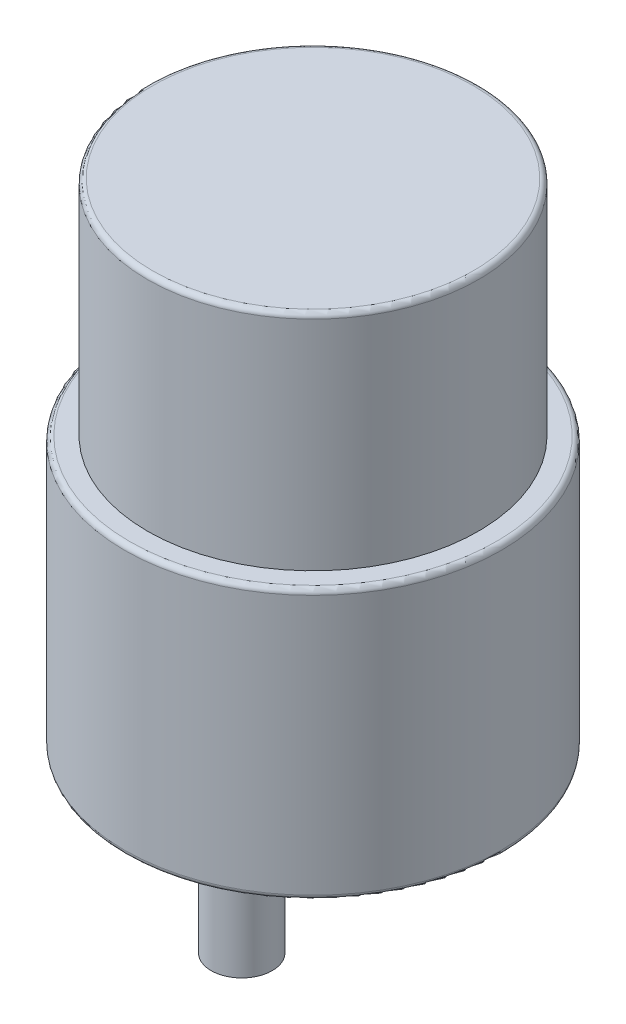
ISO-10303-21;
HEADER;
FILE_DESCRIPTION(('STEP AP214'),'2;1');
FILE_NAME('part.step','',(''),(''),'','','');
FILE_SCHEMA(('AUTOMOTIVE_DESIGN { 1 0 10303 214 1 1 1 1 }'));
ENDSEC;
DATA;
#1=APPLICATION_CONTEXT('core data for automotive mechanical design processes');
#2=APPLICATION_PROTOCOL_DEFINITION('international standard','automotive_design',2000,#1);
#3=PRODUCT_CONTEXT('',#1,'mechanical');
#4=PRODUCT('Part','Part','',(#3));
#5=PRODUCT_RELATED_PRODUCT_CATEGORY('part','',(#4));
#6=PRODUCT_DEFINITION_FORMATION('','',#4);
#7=PRODUCT_DEFINITION_CONTEXT('part definition',#1,'design');
#8=PRODUCT_DEFINITION('design','',#6,#7);
#9=PRODUCT_DEFINITION_SHAPE('','',#8);
#10=(LENGTH_UNIT() NAMED_UNIT(*) SI_UNIT(.MILLI.,.METRE.));
#11=(NAMED_UNIT(*) PLANE_ANGLE_UNIT() SI_UNIT($,.RADIAN.));
#12=(NAMED_UNIT(*) SI_UNIT($,.STERADIAN.) SOLID_ANGLE_UNIT());
#13=UNCERTAINTY_MEASURE_WITH_UNIT(LENGTH_MEASURE(1.E-05),#10,'distance_accuracy_value','');
#14=(GEOMETRIC_REPRESENTATION_CONTEXT(3) GLOBAL_UNCERTAINTY_ASSIGNED_CONTEXT((#13)) GLOBAL_UNIT_ASSIGNED_CONTEXT((#10,
#11,#12)) REPRESENTATION_CONTEXT('',''));
#15=CARTESIAN_POINT('',(0.,0.,0.));
#16=DIRECTION('',(0.,0.,1.));
#17=DIRECTION('',(1.,0.,0.));
#18=AXIS2_PLACEMENT_3D('',#15,#16,#17);
#19=CARTESIAN_POINT('',(0.,26.5,0.));
#20=DIRECTION('',(0.,-1.,0.));
#21=DIRECTION('',(0.,0.,-1.));
#22=AXIS2_PLACEMENT_3D('',#19,#20,#21);
#23=CYLINDRICAL_SURFACE('',#22,18.5);
#24=CARTESIAN_POINT('',(0.,26.,0.));
#25=DIRECTION('',(0.,1.,0.));
#26=DIRECTION('',(0.,0.,1.));
#27=AXIS2_PLACEMENT_3D('',#24,#25,#26);
#28=CIRCLE('',#27,18.5);
#29=CARTESIAN_POINT('',(0.,26.,18.5));
#30=VERTEX_POINT('',#29);
#31=EDGE_CURVE('E47',#30,#30,#28,.F.);
#32=ORIENTED_EDGE('',*,*,#31,.T.);
#33=EDGE_LOOP('',(#32));
#34=FACE_BOUND('',#33,.T.);
#35=CARTESIAN_POINT('',(0.,0.5,0.));
#36=DIRECTION('',(0.,1.,0.));
#37=DIRECTION('',(0.,0.,1.));
#38=AXIS2_PLACEMENT_3D('',#35,#36,#37);
#39=CIRCLE('',#38,18.5);
#40=CARTESIAN_POINT('',(0.,0.5,18.5));
#41=VERTEX_POINT('',#40);
#42=EDGE_CURVE('E114',#41,#41,#39,.T.);
#43=ORIENTED_EDGE('',*,*,#42,.T.);
#44=EDGE_LOOP('',(#43));
#45=FACE_BOUND('',#44,.T.);
#46=ADVANCED_FACE('F38',(#34,#45),#23,.T.);
#47=CARTESIAN_POINT('',(0.,26.5,0.));
#48=DIRECTION('',(0.,1.,0.));
#49=DIRECTION('',(0.,0.,1.));
#50=AXIS2_PLACEMENT_3D('',#47,#48,#49);
#51=PLANE('',#50);
#52=CARTESIAN_POINT('',(0.,26.5,0.));
#53=DIRECTION('',(0.,1.,0.));
#54=DIRECTION('',(0.,0.,1.));
#55=AXIS2_PLACEMENT_3D('',#52,#53,#54);
#56=CIRCLE('',#55,18.);
#57=CARTESIAN_POINT('',(0.,26.5,18.));
#58=VERTEX_POINT('',#57);
#59=EDGE_CURVE('E110',#58,#58,#56,.T.);
#60=ORIENTED_EDGE('',*,*,#59,.T.);
#61=EDGE_LOOP('',(#60));
#62=FACE_BOUND('',#61,.T.);
#63=CARTESIAN_POINT('',(0.,26.5,0.));
#64=DIRECTION('',(0.,1.,0.));
#65=DIRECTION('',(0.,0.,1.));
#66=AXIS2_PLACEMENT_3D('',#63,#64,#65);
#67=CIRCLE('',#66,16.25);
#68=CARTESIAN_POINT('',(0.,26.5,16.25));
#69=VERTEX_POINT('',#68);
#70=EDGE_CURVE('E87',#69,#69,#67,.T.);
#71=ORIENTED_EDGE('',*,*,#70,.F.);
#72=EDGE_LOOP('',(#71));
#73=FACE_BOUND('',#72,.T.);
#74=ADVANCED_FACE('F129',(#62,#73),#51,.T.);
#75=CARTESIAN_POINT('',(0.,0.,0.));
#76=DIRECTION('',(0.,1.,0.));
#77=DIRECTION('',(0.,0.,1.));
#78=AXIS2_PLACEMENT_3D('',#75,#76,#77);
#79=PLANE('',#78);
#80=CARTESIAN_POINT('',(0.,0.,-15.5));
#81=DIRECTION('',(0.,-1.,0.));
#82=DIRECTION('',(0.,0.,-1.));
#83=AXIS2_PLACEMENT_3D('',#80,#81,#82);
#84=CIRCLE('',#83,1.5);
#85=CARTESIAN_POINT('',(0.,0.,-17.));
#86=VERTEX_POINT('',#85);
#87=EDGE_CURVE('E379',#86,#86,#84,.T.);
#88=ORIENTED_EDGE('',*,*,#87,.F.);
#89=EDGE_LOOP('',(#88));
#90=FACE_BOUND('',#89,.T.);
#91=CARTESIAN_POINT('',(13.4233937586587,0.,-7.75000000000016));
#92=DIRECTION('',(0.,-1.,0.));
#93=DIRECTION('',(0.,0.,-1.));
#94=AXIS2_PLACEMENT_3D('',#91,#92,#93);
#95=CIRCLE('',#94,1.5);
#96=CARTESIAN_POINT('',(13.4233937586587,0.,-9.25000000000016));
#97=VERTEX_POINT('',#96);
#98=EDGE_CURVE('E391',#97,#97,#95,.T.);
#99=ORIENTED_EDGE('',*,*,#98,.F.);
#100=EDGE_LOOP('',(#99));
#101=FACE_BOUND('',#100,.T.);
#102=CARTESIAN_POINT('',(13.4233937586589,0.,7.74999999999987));
#103=DIRECTION('',(0.,-1.,0.));
#104=DIRECTION('',(0.,0.,-1.));
#105=AXIS2_PLACEMENT_3D('',#102,#103,#104);
#106=CIRCLE('',#105,1.5);
#107=CARTESIAN_POINT('',(13.4233937586589,0.,6.24999999999988));
#108=VERTEX_POINT('',#107);
#109=EDGE_CURVE('E390',#108,#108,#106,.T.);
#110=ORIENTED_EDGE('',*,*,#109,.F.);
#111=EDGE_LOOP('',(#110));
#112=FACE_BOUND('',#111,.T.);
#113=CARTESIAN_POINT('',(1.08235921504137E-13,0.,15.5));
#114=DIRECTION('',(0.,-1.,0.));
#115=DIRECTION('',(0.,0.,-1.));
#116=AXIS2_PLACEMENT_3D('',#113,#114,#115);
#117=CIRCLE('',#116,1.5);
#118=CARTESIAN_POINT('',(1.08235921504137E-13,0.,14.));
#119=VERTEX_POINT('',#118);
#120=EDGE_CURVE('E414',#119,#119,#117,.T.);
#121=ORIENTED_EDGE('',*,*,#120,.F.);
#122=EDGE_LOOP('',(#121));
#123=FACE_BOUND('',#122,.T.);
#124=CARTESIAN_POINT('',(-13.4233937586588,0.,7.75000000000006));
#125=DIRECTION('',(0.,-1.,0.));
#126=DIRECTION('',(0.,0.,-1.));
#127=AXIS2_PLACEMENT_3D('',#124,#125,#126);
#128=CIRCLE('',#127,1.5);
#129=CARTESIAN_POINT('',(-13.4233937586588,0.,6.25000000000006));
#130=VERTEX_POINT('',#129);
#131=EDGE_CURVE('E406',#130,#130,#128,.T.);
#132=ORIENTED_EDGE('',*,*,#131,.F.);
#133=EDGE_LOOP('',(#132));
#134=FACE_BOUND('',#133,.T.);
#135=CARTESIAN_POINT('',(-13.4233937586588,0.,-7.74999999999997));
#136=DIRECTION('',(0.,-1.,0.));
#137=DIRECTION('',(0.,0.,-1.));
#138=AXIS2_PLACEMENT_3D('',#135,#136,#137);
#139=CIRCLE('',#138,1.5);
#140=CARTESIAN_POINT('',(-13.4233937586588,0.,-9.24999999999997));
#141=VERTEX_POINT('',#140);
#142=EDGE_CURVE('E398',#141,#141,#139,.T.);
#143=ORIENTED_EDGE('',*,*,#142,.F.);
#144=EDGE_LOOP('',(#143));
#145=FACE_BOUND('',#144,.T.);
#146=CARTESIAN_POINT('',(0.,0.,0.));
#147=DIRECTION('',(0.,1.,0.));
#148=DIRECTION('',(0.,0.,1.));
#149=AXIS2_PLACEMENT_3D('',#146,#147,#148);
#150=CIRCLE('',#149,18.);
#151=CARTESIAN_POINT('',(0.,0.,18.));
#152=VERTEX_POINT('',#151);
#153=EDGE_CURVE('E11',#152,#152,#150,.F.);
#154=ORIENTED_EDGE('',*,*,#153,.T.);
#155=EDGE_LOOP('',(#154));
#156=FACE_BOUND('',#155,.T.);
#157=CARTESIAN_POINT('',(-7.,0.,0.));
#158=DIRECTION('',(0.,1.,0.));
#159=DIRECTION('',(0.,0.,1.));
#160=AXIS2_PLACEMENT_3D('',#157,#158,#159);
#161=CIRCLE('',#160,6.);
#162=CARTESIAN_POINT('',(-7.,0.,6.));
#163=VERTEX_POINT('',#162);
#164=EDGE_CURVE('E95',#163,#163,#161,.F.);
#165=ORIENTED_EDGE('',*,*,#164,.F.);
#166=EDGE_LOOP('',(#165));
#167=FACE_BOUND('',#166,.T.);
#168=ADVANCED_FACE('F132',(#90,#101,#112,#123,#134,#145,#156,#167),#79,.F.);
#169=CARTESIAN_POINT('',(0.,48.4,0.));
#170=DIRECTION('',(0.,-1.,0.));
#171=DIRECTION('',(0.,0.,-1.));
#172=AXIS2_PLACEMENT_3D('',#169,#170,#171);
#173=CYLINDRICAL_SURFACE('',#172,16.25);
#174=CARTESIAN_POINT('',(0.,47.9,0.));
#175=DIRECTION('',(0.,1.,0.));
#176=DIRECTION('',(0.,0.,1.));
#177=AXIS2_PLACEMENT_3D('',#174,#175,#176);
#178=CIRCLE('',#177,16.25);
#179=CARTESIAN_POINT('',(0.,47.9,16.25));
#180=VERTEX_POINT('',#179);
#181=EDGE_CURVE('E106',#180,#180,#178,.F.);
#182=ORIENTED_EDGE('',*,*,#181,.T.);
#183=EDGE_LOOP('',(#182));
#184=FACE_BOUND('',#183,.T.);
#185=ORIENTED_EDGE('',*,*,#70,.T.);
#186=EDGE_LOOP('',(#185));
#187=FACE_BOUND('',#186,.T.);
#188=ADVANCED_FACE('F136',(#184,#187),#173,.T.);
#189=CARTESIAN_POINT('',(0.,48.4,0.));
#190=DIRECTION('',(0.,1.,0.));
#191=DIRECTION('',(0.,0.,1.));
#192=AXIS2_PLACEMENT_3D('',#189,#190,#191);
#193=PLANE('',#192);
#194=CARTESIAN_POINT('',(0.,48.4,0.));
#195=DIRECTION('',(0.,1.,0.));
#196=DIRECTION('',(0.,0.,1.));
#197=AXIS2_PLACEMENT_3D('',#194,#195,#196);
#198=CIRCLE('',#197,15.75);
#199=CARTESIAN_POINT('',(0.,48.4,15.75));
#200=VERTEX_POINT('',#199);
#201=EDGE_CURVE('E94',#200,#200,#198,.T.);
#202=ORIENTED_EDGE('',*,*,#201,.T.);
#203=EDGE_LOOP('',(#202));
#204=FACE_BOUND('',#203,.T.);
#205=ADVANCED_FACE('F138',(#204),#193,.T.);
#206=CARTESIAN_POINT('',(-7.,-6.,0.));
#207=DIRECTION('',(0.,1.,0.));
#208=DIRECTION('',(0.,0.,1.));
#209=AXIS2_PLACEMENT_3D('',#206,#207,#208);
#210=CYLINDRICAL_SURFACE('',#209,6.);
#211=CARTESIAN_POINT('',(-7.,-6.,0.));
#212=DIRECTION('',(0.,-1.,0.));
#213=DIRECTION('',(0.,0.,-1.));
#214=AXIS2_PLACEMENT_3D('',#211,#212,#213);
#215=CIRCLE('',#214,6.);
#216=CARTESIAN_POINT('',(-7.,-6.,-6.));
#217=VERTEX_POINT('',#216);
#218=EDGE_CURVE('E83',#217,#217,#215,.T.);
#219=ORIENTED_EDGE('',*,*,#218,.F.);
#220=EDGE_LOOP('',(#219));
#221=FACE_BOUND('',#220,.T.);
#222=ORIENTED_EDGE('',*,*,#164,.T.);
#223=EDGE_LOOP('',(#222));
#224=FACE_BOUND('',#223,.T.);
#225=ADVANCED_FACE('F145',(#221,#224),#210,.T.);
#226=CARTESIAN_POINT('',(-7.,-6.,0.));
#227=DIRECTION('',(0.,-1.,0.));
#228=DIRECTION('',(0.,0.,-1.));
#229=AXIS2_PLACEMENT_3D('',#226,#227,#228);
#230=PLANE('',#229);
#231=CARTESIAN_POINT('',(-7.,-6.,0.));
#232=DIRECTION('',(0.,-1.,0.));
#233=DIRECTION('',(0.,0.,-1.));
#234=AXIS2_PLACEMENT_3D('',#231,#232,#233);
#235=CIRCLE('',#234,3.);
#236=CARTESIAN_POINT('',(-7.,-6.,-3.));
#237=VERTEX_POINT('',#236);
#238=EDGE_CURVE('E91',#237,#237,#235,.T.);
#239=ORIENTED_EDGE('',*,*,#238,.F.);
#240=EDGE_LOOP('',(#239));
#241=FACE_BOUND('',#240,.T.);
#242=ORIENTED_EDGE('',*,*,#218,.T.);
#243=EDGE_LOOP('',(#242));
#244=FACE_BOUND('',#243,.T.);
#245=ADVANCED_FACE('F178',(#241,#244),#230,.T.);
#246=CARTESIAN_POINT('',(-7.,-21.,0.));
#247=DIRECTION('',(0.,1.,0.));
#248=DIRECTION('',(0.,0.,1.));
#249=AXIS2_PLACEMENT_3D('',#246,#247,#248);
#250=CYLINDRICAL_SURFACE('',#249,3.);
#251=CARTESIAN_POINT('',(-7.,-21.,0.));
#252=DIRECTION('',(0.,-1.,0.));
#253=DIRECTION('',(0.,0.,-1.));
#254=AXIS2_PLACEMENT_3D('',#251,#252,#253);
#255=CIRCLE('',#254,3.);
#256=CARTESIAN_POINT('',(-9.4,-21.,-1.8));
#257=VERTEX_POINT('',#256);
#258=CARTESIAN_POINT('',(-9.4,-21.,1.8));
#259=VERTEX_POINT('',#258);
#260=EDGE_CURVE('E78',#257,#259,#255,.T.);
#261=ORIENTED_EDGE('',*,*,#260,.F.);
#262=DIRECTION('',(0.,-1.,0.));
#263=VECTOR('',#262,1.);
#264=CARTESIAN_POINT('',(-9.4,-9.,-1.8));
#265=LINE('',#264,#263);
#266=CARTESIAN_POINT('',(-9.4,-9.,-1.8));
#267=VERTEX_POINT('',#266);
#268=EDGE_CURVE('E54',#267,#257,#265,.T.);
#269=ORIENTED_EDGE('',*,*,#268,.F.);
#270=CARTESIAN_POINT('',(-7.,-9.,0.));
#271=DIRECTION('',(0.,-1.,0.));
#272=DIRECTION('',(0.,0.,-1.));
#273=AXIS2_PLACEMENT_3D('',#270,#271,#272);
#274=CIRCLE('',#273,3.);
#275=CARTESIAN_POINT('',(-9.4,-9.,1.8));
#276=VERTEX_POINT('',#275);
#277=EDGE_CURVE('E71',#276,#267,#274,.T.);
#278=ORIENTED_EDGE('',*,*,#277,.F.);
#279=DIRECTION('',(0.,-1.,0.));
#280=VECTOR('',#279,1.);
#281=CARTESIAN_POINT('',(-9.4,-9.,1.8));
#282=LINE('',#281,#280);
#283=EDGE_CURVE('E60',#276,#259,#282,.T.);
#284=ORIENTED_EDGE('',*,*,#283,.T.);
#285=EDGE_LOOP('',(#261,#269,#278,#284));
#286=FACE_BOUND('',#285,.T.);
#287=ORIENTED_EDGE('',*,*,#238,.T.);
#288=EDGE_LOOP('',(#287));
#289=FACE_BOUND('',#288,.T.);
#290=ADVANCED_FACE('F76',(#286,#289),#250,.T.);
#291=CARTESIAN_POINT('',(-7.,-21.,0.));
#292=DIRECTION('',(0.,-1.,0.));
#293=DIRECTION('',(0.,0.,-1.));
#294=AXIS2_PLACEMENT_3D('',#291,#292,#293);
#295=PLANE('',#294);
#296=DIRECTION('',(0.,0.,1.));
#297=VECTOR('',#296,1.);
#298=CARTESIAN_POINT('',(-9.4,-21.,-1.8));
#299=LINE('',#298,#297);
#300=EDGE_CURVE('E65',#257,#259,#299,.T.);
#301=ORIENTED_EDGE('',*,*,#300,.F.);
#302=ORIENTED_EDGE('',*,*,#260,.T.);
#303=EDGE_LOOP('',(#301,#302));
#304=FACE_BOUND('',#303,.T.);
#305=ADVANCED_FACE('F81',(#304),#295,.T.);
#306=CARTESIAN_POINT('',(-9.4,-9.,-1.8));
#307=DIRECTION('',(1.,0.,0.));
#308=DIRECTION('',(0.,0.,-1.));
#309=AXIS2_PLACEMENT_3D('',#306,#307,#308);
#310=PLANE('',#309);
#311=ORIENTED_EDGE('',*,*,#300,.T.);
#312=ORIENTED_EDGE('',*,*,#283,.F.);
#313=DIRECTION('',(0.,0.,1.));
#314=VECTOR('',#313,1.);
#315=CARTESIAN_POINT('',(-9.4,-9.,-1.8));
#316=LINE('',#315,#314);
#317=EDGE_CURVE('E427',#267,#276,#316,.T.);
#318=ORIENTED_EDGE('',*,*,#317,.F.);
#319=ORIENTED_EDGE('',*,*,#268,.T.);
#320=EDGE_LOOP('',(#311,#312,#318,#319));
#321=FACE_BOUND('',#320,.T.);
#322=ADVANCED_FACE('F66',(#321),#310,.F.);
#323=CARTESIAN_POINT('',(-7.,-9.,0.));
#324=DIRECTION('',(0.,-1.,0.));
#325=DIRECTION('',(0.,0.,-1.));
#326=AXIS2_PLACEMENT_3D('',#323,#324,#325);
#327=PLANE('',#326);
#328=ORIENTED_EDGE('',*,*,#277,.T.);
#329=ORIENTED_EDGE('',*,*,#317,.T.);
#330=EDGE_LOOP('',(#328,#329));
#331=FACE_BOUND('',#330,.T.);
#332=ADVANCED_FACE('F156',(#331),#327,.T.);
#333=CARTESIAN_POINT('',(0.,47.9,0.));
#334=DIRECTION('',(0.,1.,0.));
#335=DIRECTION('',(0.,0.,1.));
#336=AXIS2_PLACEMENT_3D('',#333,#334,#335);
#337=TOROIDAL_SURFACE('',#336,15.75,0.5);
#338=ORIENTED_EDGE('',*,*,#181,.F.);
#339=EDGE_LOOP('',(#338));
#340=FACE_BOUND('',#339,.T.);
#341=ORIENTED_EDGE('',*,*,#201,.F.);
#342=EDGE_LOOP('',(#341));
#343=FACE_BOUND('',#342,.T.);
#344=ADVANCED_FACE('F126',(#340,#343),#337,.T.);
#345=CARTESIAN_POINT('',(0.,26.,0.));
#346=DIRECTION('',(0.,1.,0.));
#347=DIRECTION('',(0.,0.,1.));
#348=AXIS2_PLACEMENT_3D('',#345,#346,#347);
#349=TOROIDAL_SURFACE('',#348,18.,0.5);
#350=ORIENTED_EDGE('',*,*,#31,.F.);
#351=EDGE_LOOP('',(#350));
#352=FACE_BOUND('',#351,.T.);
#353=ORIENTED_EDGE('',*,*,#59,.F.);
#354=EDGE_LOOP('',(#353));
#355=FACE_BOUND('',#354,.T.);
#356=ADVANCED_FACE('F123',(#352,#355),#349,.T.);
#357=CARTESIAN_POINT('',(0.,0.5,0.));
#358=DIRECTION('',(0.,1.,0.));
#359=DIRECTION('',(0.,0.,1.));
#360=AXIS2_PLACEMENT_3D('',#357,#358,#359);
#361=TOROIDAL_SURFACE('',#360,18.,0.5);
#362=ORIENTED_EDGE('',*,*,#153,.F.);
#363=EDGE_LOOP('',(#362));
#364=FACE_BOUND('',#363,.T.);
#365=ORIENTED_EDGE('',*,*,#42,.F.);
#366=EDGE_LOOP('',(#365));
#367=FACE_BOUND('',#366,.T.);
#368=ADVANCED_FACE('F40',(#364,#367),#361,.T.);
#369=CARTESIAN_POINT('',(-13.4233937586588,3.,-7.74999999999997));
#370=DIRECTION('',(0.,-1.,0.));
#371=DIRECTION('',(0.,0.,-1.));
#372=AXIS2_PLACEMENT_3D('',#369,#370,#371);
#373=CYLINDRICAL_SURFACE('',#372,1.5);
#374=CARTESIAN_POINT('',(-13.4233937586588,3.,-7.74999999999997));
#375=DIRECTION('',(0.,-1.,0.));
#376=DIRECTION('',(0.,0.,-1.));
#377=AXIS2_PLACEMENT_3D('',#374,#375,#376);
#378=CIRCLE('',#377,1.5);
#379=CARTESIAN_POINT('',(-13.4233937586588,3.,-9.24999999999997));
#380=VERTEX_POINT('',#379);
#381=EDGE_CURVE('E383',#380,#380,#378,.T.);
#382=ORIENTED_EDGE('',*,*,#381,.F.);
#383=EDGE_LOOP('',(#382));
#384=FACE_BOUND('',#383,.T.);
#385=ORIENTED_EDGE('',*,*,#142,.T.);
#386=EDGE_LOOP('',(#385));
#387=FACE_BOUND('',#386,.T.);
#388=ADVANCED_FACE('F251',(#384,#387),#373,.F.);
#389=CARTESIAN_POINT('',(-13.4233937586588,3.,-7.74999999999997));
#390=DIRECTION('',(0.,-1.,0.));
#391=DIRECTION('',(0.,0.,-1.));
#392=AXIS2_PLACEMENT_3D('',#389,#390,#391);
#393=PLANE('',#392);
#394=ORIENTED_EDGE('',*,*,#381,.T.);
#395=EDGE_LOOP('',(#394));
#396=FACE_BOUND('',#395,.T.);
#397=ADVANCED_FACE('F265',(#396),#393,.T.);
#398=CARTESIAN_POINT('',(-13.4233937586588,3.,7.75000000000006));
#399=DIRECTION('',(0.,-1.,0.));
#400=DIRECTION('',(0.,0.,-1.));
#401=AXIS2_PLACEMENT_3D('',#398,#399,#400);
#402=CYLINDRICAL_SURFACE('',#401,1.5);
#403=CARTESIAN_POINT('',(-13.4233937586588,3.,7.75000000000006));
#404=DIRECTION('',(0.,-1.,0.));
#405=DIRECTION('',(0.,0.,-1.));
#406=AXIS2_PLACEMENT_3D('',#403,#404,#405);
#407=CIRCLE('',#406,1.5);
#408=CARTESIAN_POINT('',(-13.4233937586588,3.,6.25000000000006));
#409=VERTEX_POINT('',#408);
#410=EDGE_CURVE('E402',#409,#409,#407,.T.);
#411=ORIENTED_EDGE('',*,*,#410,.F.);
#412=EDGE_LOOP('',(#411));
#413=FACE_BOUND('',#412,.T.);
#414=ORIENTED_EDGE('',*,*,#131,.T.);
#415=EDGE_LOOP('',(#414));
#416=FACE_BOUND('',#415,.T.);
#417=ADVANCED_FACE('F275',(#413,#416),#402,.F.);
#418=CARTESIAN_POINT('',(-13.4233937586588,3.,7.75000000000006));
#419=DIRECTION('',(0.,-1.,0.));
#420=DIRECTION('',(0.,0.,-1.));
#421=AXIS2_PLACEMENT_3D('',#418,#419,#420);
#422=PLANE('',#421);
#423=ORIENTED_EDGE('',*,*,#410,.T.);
#424=EDGE_LOOP('',(#423));
#425=FACE_BOUND('',#424,.T.);
#426=ADVANCED_FACE('F285',(#425),#422,.T.);
#427=CARTESIAN_POINT('',(1.08235921504137E-13,3.,15.5));
#428=DIRECTION('',(0.,-1.,0.));
#429=DIRECTION('',(0.,0.,-1.));
#430=AXIS2_PLACEMENT_3D('',#427,#428,#429);
#431=CYLINDRICAL_SURFACE('',#430,1.5);
#432=CARTESIAN_POINT('',(1.08235921504137E-13,3.,15.5));
#433=DIRECTION('',(0.,-1.,0.));
#434=DIRECTION('',(0.,0.,-1.));
#435=AXIS2_PLACEMENT_3D('',#432,#433,#434);
#436=CIRCLE('',#435,1.5);
#437=CARTESIAN_POINT('',(1.08235921504137E-13,3.,14.));
#438=VERTEX_POINT('',#437);
#439=EDGE_CURVE('E410',#438,#438,#436,.T.);
#440=ORIENTED_EDGE('',*,*,#439,.F.);
#441=EDGE_LOOP('',(#440));
#442=FACE_BOUND('',#441,.T.);
#443=ORIENTED_EDGE('',*,*,#120,.T.);
#444=EDGE_LOOP('',(#443));
#445=FACE_BOUND('',#444,.T.);
#446=ADVANCED_FACE('F295',(#442,#445),#431,.F.);
#447=CARTESIAN_POINT('',(1.08235921504137E-13,3.,15.5));
#448=DIRECTION('',(0.,-1.,0.));
#449=DIRECTION('',(0.,0.,-1.));
#450=AXIS2_PLACEMENT_3D('',#447,#448,#449);
#451=PLANE('',#450);
#452=ORIENTED_EDGE('',*,*,#439,.T.);
#453=EDGE_LOOP('',(#452));
#454=FACE_BOUND('',#453,.T.);
#455=ADVANCED_FACE('F305',(#454),#451,.T.);
#456=CARTESIAN_POINT('',(13.4233937586589,3.,7.74999999999987));
#457=DIRECTION('',(0.,-1.,0.));
#458=DIRECTION('',(0.,0.,-1.));
#459=AXIS2_PLACEMENT_3D('',#456,#457,#458);
#460=CYLINDRICAL_SURFACE('',#459,1.5);
#461=CARTESIAN_POINT('',(13.4233937586589,3.,7.74999999999987));
#462=DIRECTION('',(0.,-1.,0.));
#463=DIRECTION('',(0.,0.,-1.));
#464=AXIS2_PLACEMENT_3D('',#461,#462,#463);
#465=CIRCLE('',#464,1.5);
#466=CARTESIAN_POINT('',(13.4233937586589,3.,6.24999999999988));
#467=VERTEX_POINT('',#466);
#468=EDGE_CURVE('E418',#467,#467,#465,.T.);
#469=ORIENTED_EDGE('',*,*,#468,.F.);
#470=EDGE_LOOP('',(#469));
#471=FACE_BOUND('',#470,.T.);
#472=ORIENTED_EDGE('',*,*,#109,.T.);
#473=EDGE_LOOP('',(#472));
#474=FACE_BOUND('',#473,.T.);
#475=ADVANCED_FACE('F171',(#471,#474),#460,.F.);
#476=CARTESIAN_POINT('',(13.4233937586589,3.,7.74999999999987));
#477=DIRECTION('',(0.,-1.,0.));
#478=DIRECTION('',(0.,0.,-1.));
#479=AXIS2_PLACEMENT_3D('',#476,#477,#478);
#480=PLANE('',#479);
#481=ORIENTED_EDGE('',*,*,#468,.T.);
#482=EDGE_LOOP('',(#481));
#483=FACE_BOUND('',#482,.T.);
#484=ADVANCED_FACE('F324',(#483),#480,.T.);
#485=CARTESIAN_POINT('',(13.4233937586587,3.,-7.75000000000016));
#486=DIRECTION('',(0.,-1.,0.));
#487=DIRECTION('',(0.,0.,-1.));
#488=AXIS2_PLACEMENT_3D('',#485,#486,#487);
#489=CYLINDRICAL_SURFACE('',#488,1.5);
#490=CARTESIAN_POINT('',(13.4233937586587,3.,-7.75000000000016));
#491=DIRECTION('',(0.,-1.,0.));
#492=DIRECTION('',(0.,0.,-1.));
#493=AXIS2_PLACEMENT_3D('',#490,#491,#492);
#494=CIRCLE('',#493,1.5);
#495=CARTESIAN_POINT('',(13.4233937586587,3.,-9.25000000000016));
#496=VERTEX_POINT('',#495);
#497=EDGE_CURVE('E386',#496,#496,#494,.T.);
#498=ORIENTED_EDGE('',*,*,#497,.F.);
#499=EDGE_LOOP('',(#498));
#500=FACE_BOUND('',#499,.T.);
#501=ORIENTED_EDGE('',*,*,#98,.T.);
#502=EDGE_LOOP('',(#501));
#503=FACE_BOUND('',#502,.T.);
#504=ADVANCED_FACE('F333',(#500,#503),#489,.F.);
#505=CARTESIAN_POINT('',(13.4233937586587,3.,-7.75000000000016));
#506=DIRECTION('',(0.,-1.,0.));
#507=DIRECTION('',(0.,0.,-1.));
#508=AXIS2_PLACEMENT_3D('',#505,#506,#507);
#509=PLANE('',#508);
#510=ORIENTED_EDGE('',*,*,#497,.T.);
#511=EDGE_LOOP('',(#510));
#512=FACE_BOUND('',#511,.T.);
#513=ADVANCED_FACE('F342',(#512),#509,.T.);
#514=CARTESIAN_POINT('',(0.,3.,-15.5));
#515=DIRECTION('',(0.,-1.,0.));
#516=DIRECTION('',(0.,0.,-1.));
#517=AXIS2_PLACEMENT_3D('',#514,#515,#516);
#518=CYLINDRICAL_SURFACE('',#517,1.5);
#519=CARTESIAN_POINT('',(0.,3.,-15.5));
#520=DIRECTION('',(0.,-1.,0.));
#521=DIRECTION('',(0.,0.,-1.));
#522=AXIS2_PLACEMENT_3D('',#519,#520,#521);
#523=CIRCLE('',#522,1.5);
#524=CARTESIAN_POINT('',(0.,3.,-17.));
#525=VERTEX_POINT('',#524);
#526=EDGE_CURVE('E72',#525,#525,#523,.T.);
#527=ORIENTED_EDGE('',*,*,#526,.F.);
#528=EDGE_LOOP('',(#527));
#529=FACE_BOUND('',#528,.T.);
#530=ORIENTED_EDGE('',*,*,#87,.T.);
#531=EDGE_LOOP('',(#530));
#532=FACE_BOUND('',#531,.T.);
#533=ADVANCED_FACE('F352',(#529,#532),#518,.F.);
#534=CARTESIAN_POINT('',(0.,3.,-15.5));
#535=DIRECTION('',(0.,-1.,0.));
#536=DIRECTION('',(0.,0.,-1.));
#537=AXIS2_PLACEMENT_3D('',#534,#535,#536);
#538=PLANE('',#537);
#539=ORIENTED_EDGE('',*,*,#526,.T.);
#540=EDGE_LOOP('',(#539));
#541=FACE_BOUND('',#540,.T.);
#542=ADVANCED_FACE('F362',(#541),#538,.T.);
#543=CLOSED_SHELL('',(#46,#74,#168,#188,#205,#225,#245,#290,#305,#322,#332,#344,#356,#368,#388,
#397,#417,#426,#446,#455,#475,#484,#504,#513,#533,#542));
#544=MANIFOLD_SOLID_BREP('B2',#543);
#545=ADVANCED_BREP_SHAPE_REPRESENTATION('',(#18,#544),#14);
#546=SHAPE_DEFINITION_REPRESENTATION(#9,#545);
ENDSEC;
END-ISO-10303-21;
